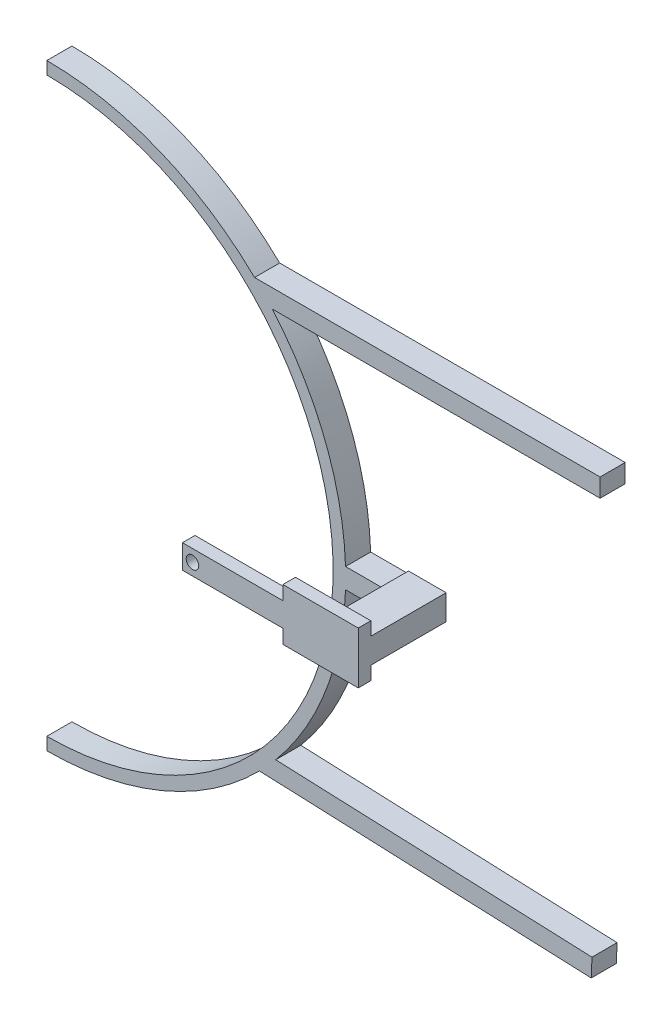
ISO-10303-21;
HEADER;
FILE_DESCRIPTION(('STEP AP214'),'2;1');
FILE_NAME('part.step','',(''),(''),'','','');
FILE_SCHEMA(('AUTOMOTIVE_DESIGN { 1 0 10303 214 1 1 1 1 }'));
ENDSEC;
DATA;
#1=APPLICATION_CONTEXT('core data for automotive mechanical design processes');
#2=APPLICATION_PROTOCOL_DEFINITION('international standard','automotive_design',2000,#1);
#3=PRODUCT_CONTEXT('',#1,'mechanical');
#4=PRODUCT('Part','Part','',(#3));
#5=PRODUCT_RELATED_PRODUCT_CATEGORY('part','',(#4));
#6=PRODUCT_DEFINITION_FORMATION('','',#4);
#7=PRODUCT_DEFINITION_CONTEXT('part definition',#1,'design');
#8=PRODUCT_DEFINITION('design','',#6,#7);
#9=PRODUCT_DEFINITION_SHAPE('','',#8);
#10=(LENGTH_UNIT() NAMED_UNIT(*) SI_UNIT(.MILLI.,.METRE.));
#11=(NAMED_UNIT(*) PLANE_ANGLE_UNIT() SI_UNIT($,.RADIAN.));
#12=(NAMED_UNIT(*) SI_UNIT($,.STERADIAN.) SOLID_ANGLE_UNIT());
#13=UNCERTAINTY_MEASURE_WITH_UNIT(LENGTH_MEASURE(1.E-05),#10,'distance_accuracy_value','');
#14=(GEOMETRIC_REPRESENTATION_CONTEXT(3) GLOBAL_UNCERTAINTY_ASSIGNED_CONTEXT((#13)) GLOBAL_UNIT_ASSIGNED_CONTEXT((#10,
#11,#12)) REPRESENTATION_CONTEXT('',''));
#15=CARTESIAN_POINT('',(0.,0.,0.));
#16=DIRECTION('',(0.,0.,1.));
#17=DIRECTION('',(1.,0.,0.));
#18=AXIS2_PLACEMENT_3D('',#15,#16,#17);
#19=CARTESIAN_POINT('',(-134.,0.,-20.));
#20=DIRECTION('',(0.,0.,-1.));
#21=DIRECTION('',(-1.,0.,0.));
#22=AXIS2_PLACEMENT_3D('',#19,#20,#21);
#23=CYLINDRICAL_SURFACE('',#22,119.);
#24=DIRECTION('',(0.,0.,-1.));
#25=VECTOR('',#24,1.);
#26=CARTESIAN_POINT('',(-42.8759842022691,-76.5337425250779,-20.));
#27=LINE('',#26,#25);
#28=CARTESIAN_POINT('',(-42.8759842022691,-76.5337425250779,-30.));
#29=VERTEX_POINT('',#28);
#30=CARTESIAN_POINT('',(-42.8759842022691,-76.5337425250779,-20.));
#31=VERTEX_POINT('',#30);
#32=EDGE_CURVE('E11',#29,#31,#27,.F.);
#33=ORIENTED_EDGE('',*,*,#32,.F.);
#34=CARTESIAN_POINT('',(-134.,0.,-30.));
#35=DIRECTION('',(0.,0.,-1.));
#36=DIRECTION('',(-1.,0.,0.));
#37=AXIS2_PLACEMENT_3D('',#34,#35,#36);
#38=CIRCLE('',#37,119.);
#39=CARTESIAN_POINT('',(-15.0672458907975,-4.,-30.));
#40=VERTEX_POINT('',#39);
#41=EDGE_CURVE('E298',#40,#29,#38,.T.);
#42=ORIENTED_EDGE('',*,*,#41,.F.);
#43=DIRECTION('',(0.,0.,-1.));
#44=VECTOR('',#43,1.);
#45=CARTESIAN_POINT('',(-15.0672458907975,-4.,-20.));
#46=LINE('',#45,#44);
#47=CARTESIAN_POINT('',(-15.0672458907975,-4.,-20.));
#48=VERTEX_POINT('',#47);
#49=EDGE_CURVE('E428',#48,#40,#46,.T.);
#50=ORIENTED_EDGE('',*,*,#49,.F.);
#51=CARTESIAN_POINT('',(-134.,0.,-20.));
#52=DIRECTION('',(0.,0.,-1.));
#53=DIRECTION('',(-1.,0.,0.));
#54=AXIS2_PLACEMENT_3D('',#51,#52,#53);
#55=CIRCLE('',#54,119.);
#56=EDGE_CURVE('E285',#48,#31,#55,.T.);
#57=ORIENTED_EDGE('',*,*,#56,.T.);
#58=EDGE_LOOP('',(#33,#42,#50,#57));
#59=FACE_BOUND('',#58,.T.);
#60=ADVANCED_FACE('F35',(#59),#23,.T.);
#61=DIRECTION('',(0.,0.,-1.));
#62=VECTOR('',#61,1.);
#63=CARTESIAN_POINT('',(-44.304263479232,78.2027803213991,-20.));
#64=LINE('',#63,#62);
#65=CARTESIAN_POINT('',(-44.304263479232,78.2027803213991,-20.));
#66=VERTEX_POINT('',#65);
#67=CARTESIAN_POINT('',(-44.3042634792321,78.2027803213991,-30.));
#68=VERTEX_POINT('',#67);
#69=EDGE_CURVE('E265',#66,#68,#64,.T.);
#70=ORIENTED_EDGE('',*,*,#69,.F.);
#71=CARTESIAN_POINT('',(-15.0672458907975,4.,-20.));
#72=VERTEX_POINT('',#71);
#73=EDGE_CURVE('E284',#66,#72,#55,.T.);
#74=ORIENTED_EDGE('',*,*,#73,.T.);
#75=DIRECTION('',(0.,0.,-1.));
#76=VECTOR('',#75,1.);
#77=CARTESIAN_POINT('',(-15.0672458907975,4.,-20.));
#78=LINE('',#77,#76);
#79=CARTESIAN_POINT('',(-15.0672458907975,4.,-30.));
#80=VERTEX_POINT('',#79);
#81=EDGE_CURVE('E304',#80,#72,#78,.F.);
#82=ORIENTED_EDGE('',*,*,#81,.F.);
#83=EDGE_CURVE('E297',#68,#80,#38,.T.);
#84=ORIENTED_EDGE('',*,*,#83,.F.);
#85=EDGE_LOOP('',(#70,#74,#82,#84));
#86=FACE_BOUND('',#85,.T.);
#87=ADVANCED_FACE('F446',(#86),#23,.T.);
#88=CARTESIAN_POINT('',(0.,5.,-30.));
#89=DIRECTION('',(1.,0.,0.));
#90=DIRECTION('',(0.,1.,0.));
#91=AXIS2_PLACEMENT_3D('',#88,#89,#90);
#92=PLANE('',#91);
#93=DIRECTION('',(0.,0.,-1.));
#94=VECTOR('',#93,1.);
#95=CARTESIAN_POINT('',(0.,4.,-30.));
#96=LINE('',#95,#94);
#97=CARTESIAN_POINT('',(0.,4.,-20.));
#98=VERTEX_POINT('',#97);
#99=CARTESIAN_POINT('',(0.,4.,-30.));
#100=VERTEX_POINT('',#99);
#101=EDGE_CURVE('E317',#98,#100,#96,.T.);
#102=ORIENTED_EDGE('',*,*,#101,.F.);
#103=DIRECTION('',(0.,1.,0.));
#104=VECTOR('',#103,1.);
#105=CARTESIAN_POINT('',(0.,4.,-20.));
#106=LINE('',#105,#104);
#107=CARTESIAN_POINT('',(0.,-4.,-20.));
#108=VERTEX_POINT('',#107);
#109=EDGE_CURVE('E314',#108,#98,#106,.T.);
#110=ORIENTED_EDGE('',*,*,#109,.F.);
#111=DIRECTION('',(0.,0.,1.));
#112=VECTOR('',#111,1.);
#113=CARTESIAN_POINT('',(0.,-4.,-30.));
#114=LINE('',#113,#112);
#115=CARTESIAN_POINT('',(0.,-4.,-30.));
#116=VERTEX_POINT('',#115);
#117=EDGE_CURVE('E320',#116,#108,#114,.T.);
#118=ORIENTED_EDGE('',*,*,#117,.F.);
#119=DIRECTION('',(0.,1.,0.));
#120=VECTOR('',#119,1.);
#121=CARTESIAN_POINT('',(0.,5.,-30.));
#122=LINE('',#121,#120);
#123=CARTESIAN_POINT('',(0.,-5.,-30.));
#124=VERTEX_POINT('',#123);
#125=EDGE_CURVE('E332',#124,#116,#122,.T.);
#126=ORIENTED_EDGE('',*,*,#125,.F.);
#127=DIRECTION('',(0.,0.,1.));
#128=VECTOR('',#127,1.);
#129=CARTESIAN_POINT('',(0.,-5.,-30.));
#130=LINE('',#129,#128);
#131=CARTESIAN_POINT('',(0.,-5.,0.));
#132=VERTEX_POINT('',#131);
#133=EDGE_CURVE('E342',#124,#132,#130,.T.);
#134=ORIENTED_EDGE('',*,*,#133,.T.);
#135=DIRECTION('',(0.,1.,0.));
#136=VECTOR('',#135,1.);
#137=CARTESIAN_POINT('',(0.,5.,0.));
#138=LINE('',#137,#136);
#139=CARTESIAN_POINT('',(0.,5.,0.));
#140=VERTEX_POINT('',#139);
#141=EDGE_CURVE('E331',#132,#140,#138,.T.);
#142=ORIENTED_EDGE('',*,*,#141,.T.);
#143=DIRECTION('',(0.,0.,1.));
#144=VECTOR('',#143,1.);
#145=CARTESIAN_POINT('',(0.,5.,-30.));
#146=LINE('',#145,#144);
#147=CARTESIAN_POINT('',(0.,5.,-30.));
#148=VERTEX_POINT('',#147);
#149=EDGE_CURVE('E359',#148,#140,#146,.T.);
#150=ORIENTED_EDGE('',*,*,#149,.F.);
#151=EDGE_CURVE('E336',#100,#148,#122,.T.);
#152=ORIENTED_EDGE('',*,*,#151,.F.);
#153=EDGE_LOOP('',(#102,#110,#118,#126,#134,#142,#150,#152));
#154=FACE_BOUND('',#153,.T.);
#155=ADVANCED_FACE('F490',(#154),#92,.F.);
#156=CARTESIAN_POINT('',(0.,0.,5.));
#157=DIRECTION('',(0.,0.,-1.));
#158=DIRECTION('',(-1.,0.,0.));
#159=AXIS2_PLACEMENT_3D('',#156,#157,#158);
#160=PLANE('',#159);
#161=DIRECTION('',(-1.,0.,0.));
#162=VECTOR('',#161,1.);
#163=CARTESIAN_POINT('',(15.,10.3276353276353,5.));
#164=LINE('',#163,#162);
#165=CARTESIAN_POINT('',(15.,10.3276353276353,5.));
#166=VERTEX_POINT('',#165);
#167=CARTESIAN_POINT('',(-15.,10.3276353276353,5.));
#168=VERTEX_POINT('',#167);
#169=EDGE_CURVE('E369',#166,#168,#164,.T.);
#170=ORIENTED_EDGE('',*,*,#169,.T.);
#171=DIRECTION('',(0.,-1.,0.));
#172=VECTOR('',#171,1.);
#173=CARTESIAN_POINT('',(-15.,4.74891782983586,5.));
#174=LINE('',#173,#172);
#175=CARTESIAN_POINT('',(-15.,4.74891782983586,5.));
#176=VERTEX_POINT('',#175);
#177=EDGE_CURVE('E372',#168,#176,#174,.T.);
#178=ORIENTED_EDGE('',*,*,#177,.T.);
#179=DIRECTION('',(-1.,0.,0.));
#180=VECTOR('',#179,1.);
#181=CARTESIAN_POINT('',(-15.,4.74891782983586,5.));
#182=LINE('',#181,#180);
#183=CARTESIAN_POINT('',(-55.,4.74891782983585,5.));
#184=VERTEX_POINT('',#183);
#185=EDGE_CURVE('E375',#176,#184,#182,.T.);
#186=ORIENTED_EDGE('',*,*,#185,.T.);
#187=DIRECTION('',(0.,-1.,0.));
#188=VECTOR('',#187,1.);
#189=CARTESIAN_POINT('',(-55.,-4.74891782983586,5.));
#190=LINE('',#189,#188);
#191=CARTESIAN_POINT('',(-55.,-4.74891782983586,5.));
#192=VERTEX_POINT('',#191);
#193=EDGE_CURVE('E377',#184,#192,#190,.T.);
#194=ORIENTED_EDGE('',*,*,#193,.T.);
#195=DIRECTION('',(1.,0.,0.));
#196=VECTOR('',#195,1.);
#197=CARTESIAN_POINT('',(-15.,-4.74891782983586,5.));
#198=LINE('',#197,#196);
#199=CARTESIAN_POINT('',(-15.,-4.74891782983586,5.));
#200=VERTEX_POINT('',#199);
#201=EDGE_CURVE('E379',#192,#200,#198,.T.);
#202=ORIENTED_EDGE('',*,*,#201,.T.);
#203=DIRECTION('',(0.,-1.,0.));
#204=VECTOR('',#203,1.);
#205=CARTESIAN_POINT('',(-15.,-4.74891782983586,5.));
#206=LINE('',#205,#204);
#207=CARTESIAN_POINT('',(-15.,-10.3276353276353,5.));
#208=VERTEX_POINT('',#207);
#209=EDGE_CURVE('E381',#200,#208,#206,.T.);
#210=ORIENTED_EDGE('',*,*,#209,.T.);
#211=DIRECTION('',(1.,0.,0.));
#212=VECTOR('',#211,1.);
#213=CARTESIAN_POINT('',(15.,-10.3276353276353,5.));
#214=LINE('',#213,#212);
#215=CARTESIAN_POINT('',(15.,-10.3276353276353,5.));
#216=VERTEX_POINT('',#215);
#217=EDGE_CURVE('E383',#208,#216,#214,.T.);
#218=ORIENTED_EDGE('',*,*,#217,.T.);
#219=DIRECTION('',(0.,1.,0.));
#220=VECTOR('',#219,1.);
#221=CARTESIAN_POINT('',(15.,-10.3276353276353,5.));
#222=LINE('',#221,#220);
#223=EDGE_CURVE('E385',#216,#166,#222,.T.);
#224=ORIENTED_EDGE('',*,*,#223,.T.);
#225=EDGE_LOOP('',(#170,#178,#186,#194,#202,#210,#218,#224));
#226=FACE_BOUND('',#225,.T.);
#227=CARTESIAN_POINT('',(-51.,0.,5.));
#228=DIRECTION('',(0.,0.,1.));
#229=DIRECTION('',(1.,0.,0.));
#230=AXIS2_PLACEMENT_3D('',#227,#228,#229);
#231=CIRCLE('',#230,2.5);
#232=CARTESIAN_POINT('',(-48.5,0.,5.));
#233=VERTEX_POINT('',#232);
#234=EDGE_CURVE('E363',#233,#233,#231,.T.);
#235=ORIENTED_EDGE('',*,*,#234,.F.);
#236=EDGE_LOOP('',(#235));
#237=FACE_BOUND('',#236,.T.);
#238=ADVANCED_FACE('F522',(#226,#237),#160,.F.);
#239=CARTESIAN_POINT('',(0.,0.,0.));
#240=DIRECTION('',(0.,0.,-1.));
#241=DIRECTION('',(-1.,0.,0.));
#242=AXIS2_PLACEMENT_3D('',#239,#240,#241);
#243=PLANE('',#242);
#244=DIRECTION('',(-1.,0.,0.));
#245=VECTOR('',#244,1.);
#246=CARTESIAN_POINT('',(15.,-5.,0.));
#247=LINE('',#246,#245);
#248=CARTESIAN_POINT('',(15.,-5.,0.));
#249=VERTEX_POINT('',#248);
#250=EDGE_CURVE('E348',#249,#132,#247,.T.);
#251=ORIENTED_EDGE('',*,*,#250,.F.);
#252=DIRECTION('',(0.,1.,0.));
#253=VECTOR('',#252,1.);
#254=CARTESIAN_POINT('',(15.,-10.3276353276353,0.));
#255=LINE('',#254,#253);
#256=CARTESIAN_POINT('',(15.,-10.3276353276353,0.));
#257=VERTEX_POINT('',#256);
#258=EDGE_CURVE('E373',#257,#249,#255,.T.);
#259=ORIENTED_EDGE('',*,*,#258,.F.);
#260=DIRECTION('',(1.,0.,0.));
#261=VECTOR('',#260,1.);
#262=CARTESIAN_POINT('',(15.,-10.3276353276353,0.));
#263=LINE('',#262,#261);
#264=CARTESIAN_POINT('',(-15.,-10.3276353276353,0.));
#265=VERTEX_POINT('',#264);
#266=EDGE_CURVE('E400',#265,#257,#263,.T.);
#267=ORIENTED_EDGE('',*,*,#266,.F.);
#268=DIRECTION('',(0.,-1.,0.));
#269=VECTOR('',#268,1.);
#270=CARTESIAN_POINT('',(-15.,-4.74891782983586,0.));
#271=LINE('',#270,#269);
#272=CARTESIAN_POINT('',(-15.,-4.74891782983586,0.));
#273=VERTEX_POINT('',#272);
#274=EDGE_CURVE('E398',#273,#265,#271,.T.);
#275=ORIENTED_EDGE('',*,*,#274,.F.);
#276=DIRECTION('',(1.,0.,0.));
#277=VECTOR('',#276,1.);
#278=CARTESIAN_POINT('',(-15.,-4.74891782983586,0.));
#279=LINE('',#278,#277);
#280=CARTESIAN_POINT('',(-55.,-4.74891782983586,0.));
#281=VERTEX_POINT('',#280);
#282=EDGE_CURVE('E396',#281,#273,#279,.T.);
#283=ORIENTED_EDGE('',*,*,#282,.F.);
#284=DIRECTION('',(0.,-1.,0.));
#285=VECTOR('',#284,1.);
#286=CARTESIAN_POINT('',(-55.,-4.74891782983586,0.));
#287=LINE('',#286,#285);
#288=CARTESIAN_POINT('',(-55.,4.74891782983585,0.));
#289=VERTEX_POINT('',#288);
#290=EDGE_CURVE('E394',#289,#281,#287,.T.);
#291=ORIENTED_EDGE('',*,*,#290,.F.);
#292=DIRECTION('',(-1.,0.,0.));
#293=VECTOR('',#292,1.);
#294=CARTESIAN_POINT('',(-15.,4.74891782983586,0.));
#295=LINE('',#294,#293);
#296=CARTESIAN_POINT('',(-15.,4.74891782983586,0.));
#297=VERTEX_POINT('',#296);
#298=EDGE_CURVE('E392',#297,#289,#295,.T.);
#299=ORIENTED_EDGE('',*,*,#298,.F.);
#300=DIRECTION('',(0.,-1.,0.));
#301=VECTOR('',#300,1.);
#302=CARTESIAN_POINT('',(-15.,4.74891782983586,0.));
#303=LINE('',#302,#301);
#304=CARTESIAN_POINT('',(-15.,10.3276353276353,0.));
#305=VERTEX_POINT('',#304);
#306=EDGE_CURVE('E390',#305,#297,#303,.T.);
#307=ORIENTED_EDGE('',*,*,#306,.F.);
#308=DIRECTION('',(-1.,0.,0.));
#309=VECTOR('',#308,1.);
#310=CARTESIAN_POINT('',(15.,10.3276353276353,0.));
#311=LINE('',#310,#309);
#312=CARTESIAN_POINT('',(15.,10.3276353276353,0.));
#313=VERTEX_POINT('',#312);
#314=EDGE_CURVE('E366',#313,#305,#311,.T.);
#315=ORIENTED_EDGE('',*,*,#314,.F.);
#316=CARTESIAN_POINT('',(15.,5.,0.));
#317=VERTEX_POINT('',#316);
#318=EDGE_CURVE('E402',#317,#313,#255,.T.);
#319=ORIENTED_EDGE('',*,*,#318,.F.);
#320=DIRECTION('',(1.,0.,0.));
#321=VECTOR('',#320,1.);
#322=CARTESIAN_POINT('',(15.,5.,0.));
#323=LINE('',#322,#321);
#324=EDGE_CURVE('E345',#140,#317,#323,.T.);
#325=ORIENTED_EDGE('',*,*,#324,.F.);
#326=ORIENTED_EDGE('',*,*,#141,.F.);
#327=EDGE_LOOP('',(#251,#259,#267,#275,#283,#291,#299,#307,#315,#319,#325,#326));
#328=FACE_BOUND('',#327,.T.);
#329=CARTESIAN_POINT('',(-51.,0.,0.));
#330=DIRECTION('',(0.,0.,1.));
#331=DIRECTION('',(1.,0.,0.));
#332=AXIS2_PLACEMENT_3D('',#329,#330,#331);
#333=CIRCLE('',#332,2.5);
#334=CARTESIAN_POINT('',(-48.5,0.,0.));
#335=VERTEX_POINT('',#334);
#336=EDGE_CURVE('E362',#335,#335,#333,.T.);
#337=ORIENTED_EDGE('',*,*,#336,.T.);
#338=EDGE_LOOP('',(#337));
#339=FACE_BOUND('',#338,.T.);
#340=ADVANCED_FACE('F530',(#328,#339),#243,.T.);
#341=CARTESIAN_POINT('',(15.,10.3276353276353,5.));
#342=DIRECTION('',(0.,-1.,0.));
#343=DIRECTION('',(1.,0.,0.));
#344=AXIS2_PLACEMENT_3D('',#341,#342,#343);
#345=PLANE('',#344);
#346=ORIENTED_EDGE('',*,*,#314,.T.);
#347=DIRECTION('',(0.,0.,-1.));
#348=VECTOR('',#347,1.);
#349=CARTESIAN_POINT('',(-15.,10.3276353276353,5.));
#350=LINE('',#349,#348);
#351=EDGE_CURVE('E425',#168,#305,#350,.T.);
#352=ORIENTED_EDGE('',*,*,#351,.F.);
#353=ORIENTED_EDGE('',*,*,#169,.F.);
#354=DIRECTION('',(0.,0.,-1.));
#355=VECTOR('',#354,1.);
#356=CARTESIAN_POINT('',(15.,10.3276353276353,5.));
#357=LINE('',#356,#355);
#358=EDGE_CURVE('E387',#166,#313,#357,.T.);
#359=ORIENTED_EDGE('',*,*,#358,.T.);
#360=EDGE_LOOP('',(#346,#352,#353,#359));
#361=FACE_BOUND('',#360,.T.);
#362=ADVANCED_FACE('F37',(#361),#345,.F.);
#363=CARTESIAN_POINT('',(-15.,4.74891782983586,5.));
#364=DIRECTION('',(1.,0.,0.));
#365=DIRECTION('',(0.,0.,-1.));
#366=AXIS2_PLACEMENT_3D('',#363,#364,#365);
#367=PLANE('',#366);
#368=ORIENTED_EDGE('',*,*,#306,.T.);
#369=DIRECTION('',(0.,0.,-1.));
#370=VECTOR('',#369,1.);
#371=CARTESIAN_POINT('',(-15.,4.74891782983586,5.));
#372=LINE('',#371,#370);
#373=EDGE_CURVE('E422',#176,#297,#372,.T.);
#374=ORIENTED_EDGE('',*,*,#373,.F.);
#375=ORIENTED_EDGE('',*,*,#177,.F.);
#376=ORIENTED_EDGE('',*,*,#351,.T.);
#377=EDGE_LOOP('',(#368,#374,#375,#376));
#378=FACE_BOUND('',#377,.T.);
#379=ADVANCED_FACE('F556',(#378),#367,.F.);
#380=CARTESIAN_POINT('',(-15.,4.74891782983586,5.));
#381=DIRECTION('',(0.,-1.,0.));
#382=DIRECTION('',(1.,0.,0.));
#383=AXIS2_PLACEMENT_3D('',#380,#381,#382);
#384=PLANE('',#383);
#385=ORIENTED_EDGE('',*,*,#298,.T.);
#386=DIRECTION('',(0.,0.,-1.));
#387=VECTOR('',#386,1.);
#388=CARTESIAN_POINT('',(-55.,4.74891782983585,5.));
#389=LINE('',#388,#387);
#390=EDGE_CURVE('E419',#184,#289,#389,.T.);
#391=ORIENTED_EDGE('',*,*,#390,.F.);
#392=ORIENTED_EDGE('',*,*,#185,.F.);
#393=ORIENTED_EDGE('',*,*,#373,.T.);
#394=EDGE_LOOP('',(#385,#391,#392,#393));
#395=FACE_BOUND('',#394,.T.);
#396=ADVANCED_FACE('F553',(#395),#384,.F.);
#397=CARTESIAN_POINT('',(-55.,-4.74891782983586,5.));
#398=DIRECTION('',(1.,0.,0.));
#399=DIRECTION('',(0.,0.,-1.));
#400=AXIS2_PLACEMENT_3D('',#397,#398,#399);
#401=PLANE('',#400);
#402=ORIENTED_EDGE('',*,*,#290,.T.);
#403=DIRECTION('',(0.,0.,-1.));
#404=VECTOR('',#403,1.);
#405=CARTESIAN_POINT('',(-55.,-4.74891782983586,5.));
#406=LINE('',#405,#404);
#407=EDGE_CURVE('E416',#192,#281,#406,.T.);
#408=ORIENTED_EDGE('',*,*,#407,.F.);
#409=ORIENTED_EDGE('',*,*,#193,.F.);
#410=ORIENTED_EDGE('',*,*,#390,.T.);
#411=EDGE_LOOP('',(#402,#408,#409,#410));
#412=FACE_BOUND('',#411,.T.);
#413=ADVANCED_FACE('F549',(#412),#401,.F.);
#414=CARTESIAN_POINT('',(-15.,-4.74891782983586,5.));
#415=DIRECTION('',(0.,1.,0.));
#416=DIRECTION('',(-1.,0.,0.));
#417=AXIS2_PLACEMENT_3D('',#414,#415,#416);
#418=PLANE('',#417);
#419=ORIENTED_EDGE('',*,*,#282,.T.);
#420=DIRECTION('',(0.,0.,-1.));
#421=VECTOR('',#420,1.);
#422=CARTESIAN_POINT('',(-15.,-4.74891782983586,5.));
#423=LINE('',#422,#421);
#424=EDGE_CURVE('E413',#200,#273,#423,.T.);
#425=ORIENTED_EDGE('',*,*,#424,.F.);
#426=ORIENTED_EDGE('',*,*,#201,.F.);
#427=ORIENTED_EDGE('',*,*,#407,.T.);
#428=EDGE_LOOP('',(#419,#425,#426,#427));
#429=FACE_BOUND('',#428,.T.);
#430=ADVANCED_FACE('F545',(#429),#418,.F.);
#431=CARTESIAN_POINT('',(-15.,-4.74891782983586,5.));
#432=DIRECTION('',(1.,0.,0.));
#433=DIRECTION('',(0.,1.,0.));
#434=AXIS2_PLACEMENT_3D('',#431,#432,#433);
#435=PLANE('',#434);
#436=ORIENTED_EDGE('',*,*,#274,.T.);
#437=DIRECTION('',(0.,0.,-1.));
#438=VECTOR('',#437,1.);
#439=CARTESIAN_POINT('',(-15.,-10.3276353276353,5.));
#440=LINE('',#439,#438);
#441=EDGE_CURVE('E410',#208,#265,#440,.T.);
#442=ORIENTED_EDGE('',*,*,#441,.F.);
#443=ORIENTED_EDGE('',*,*,#209,.F.);
#444=ORIENTED_EDGE('',*,*,#424,.T.);
#445=EDGE_LOOP('',(#436,#442,#443,#444));
#446=FACE_BOUND('',#445,.T.);
#447=ADVANCED_FACE('F541',(#446),#435,.F.);
#448=CARTESIAN_POINT('',(15.,-10.3276353276353,5.));
#449=DIRECTION('',(0.,1.,0.));
#450=DIRECTION('',(-1.,0.,0.));
#451=AXIS2_PLACEMENT_3D('',#448,#449,#450);
#452=PLANE('',#451);
#453=ORIENTED_EDGE('',*,*,#266,.T.);
#454=DIRECTION('',(0.,0.,-1.));
#455=VECTOR('',#454,1.);
#456=CARTESIAN_POINT('',(15.,-10.3276353276353,5.));
#457=LINE('',#456,#455);
#458=EDGE_CURVE('E407',#216,#257,#457,.T.);
#459=ORIENTED_EDGE('',*,*,#458,.F.);
#460=ORIENTED_EDGE('',*,*,#217,.F.);
#461=ORIENTED_EDGE('',*,*,#441,.T.);
#462=EDGE_LOOP('',(#453,#459,#460,#461));
#463=FACE_BOUND('',#462,.T.);
#464=ADVANCED_FACE('F537',(#463),#452,.F.);
#465=CARTESIAN_POINT('',(15.,-10.3276353276353,5.));
#466=DIRECTION('',(-1.,0.,0.));
#467=DIRECTION('',(0.,0.,1.));
#468=AXIS2_PLACEMENT_3D('',#465,#466,#467);
#469=PLANE('',#468);
#470=ORIENTED_EDGE('',*,*,#258,.T.);
#471=DIRECTION('',(0.,0.,1.));
#472=VECTOR('',#471,1.);
#473=CARTESIAN_POINT('',(15.,-5.,-30.));
#474=LINE('',#473,#472);
#475=CARTESIAN_POINT('',(15.,-5.,-30.));
#476=VERTEX_POINT('',#475);
#477=EDGE_CURVE('E353',#476,#249,#474,.T.);
#478=ORIENTED_EDGE('',*,*,#477,.F.);
#479=DIRECTION('',(0.,-1.,0.));
#480=VECTOR('',#479,1.);
#481=CARTESIAN_POINT('',(15.,5.,-30.));
#482=LINE('',#481,#480);
#483=CARTESIAN_POINT('',(15.,5.,-30.));
#484=VERTEX_POINT('',#483);
#485=EDGE_CURVE('E338',#484,#476,#482,.T.);
#486=ORIENTED_EDGE('',*,*,#485,.F.);
#487=DIRECTION('',(0.,0.,1.));
#488=VECTOR('',#487,1.);
#489=CARTESIAN_POINT('',(15.,5.,-30.));
#490=LINE('',#489,#488);
#491=EDGE_CURVE('E356',#484,#317,#490,.T.);
#492=ORIENTED_EDGE('',*,*,#491,.T.);
#493=ORIENTED_EDGE('',*,*,#318,.T.);
#494=ORIENTED_EDGE('',*,*,#358,.F.);
#495=ORIENTED_EDGE('',*,*,#223,.F.);
#496=ORIENTED_EDGE('',*,*,#458,.T.);
#497=EDGE_LOOP('',(#470,#478,#486,#492,#493,#494,#495,#496));
#498=FACE_BOUND('',#497,.T.);
#499=ADVANCED_FACE('F526',(#498),#469,.F.);
#500=CARTESIAN_POINT('',(-51.,0.,5.));
#501=DIRECTION('',(0.,0.,-1.));
#502=DIRECTION('',(-1.,0.,0.));
#503=AXIS2_PLACEMENT_3D('',#500,#501,#502);
#504=CYLINDRICAL_SURFACE('',#503,2.5);
#505=ORIENTED_EDGE('',*,*,#234,.T.);
#506=EDGE_LOOP('',(#505));
#507=FACE_BOUND('',#506,.T.);
#508=ORIENTED_EDGE('',*,*,#336,.F.);
#509=EDGE_LOOP('',(#508));
#510=FACE_BOUND('',#509,.T.);
#511=ADVANCED_FACE('F518',(#507,#510),#504,.F.);
#512=CARTESIAN_POINT('',(15.,5.,-30.));
#513=DIRECTION('',(0.,-1.,0.));
#514=DIRECTION('',(0.,0.,-1.));
#515=AXIS2_PLACEMENT_3D('',#512,#513,#514);
#516=PLANE('',#515);
#517=ORIENTED_EDGE('',*,*,#324,.T.);
#518=ORIENTED_EDGE('',*,*,#491,.F.);
#519=DIRECTION('',(1.,0.,0.));
#520=VECTOR('',#519,1.);
#521=CARTESIAN_POINT('',(15.,5.,-30.));
#522=LINE('',#521,#520);
#523=EDGE_CURVE('E335',#148,#484,#522,.T.);
#524=ORIENTED_EDGE('',*,*,#523,.F.);
#525=ORIENTED_EDGE('',*,*,#149,.T.);
#526=EDGE_LOOP('',(#517,#518,#524,#525));
#527=FACE_BOUND('',#526,.T.);
#528=ADVANCED_FACE('F514',(#527),#516,.F.);
#529=CARTESIAN_POINT('',(15.,-5.,-30.));
#530=DIRECTION('',(0.,1.,0.));
#531=DIRECTION('',(0.,0.,1.));
#532=AXIS2_PLACEMENT_3D('',#529,#530,#531);
#533=PLANE('',#532);
#534=ORIENTED_EDGE('',*,*,#250,.T.);
#535=ORIENTED_EDGE('',*,*,#133,.F.);
#536=DIRECTION('',(-1.,0.,0.));
#537=VECTOR('',#536,1.);
#538=CARTESIAN_POINT('',(15.,-5.,-30.));
#539=LINE('',#538,#537);
#540=EDGE_CURVE('E340',#476,#124,#539,.T.);
#541=ORIENTED_EDGE('',*,*,#540,.F.);
#542=ORIENTED_EDGE('',*,*,#477,.T.);
#543=EDGE_LOOP('',(#534,#535,#541,#542));
#544=FACE_BOUND('',#543,.T.);
#545=ADVANCED_FACE('F511',(#544),#533,.F.);
#546=CARTESIAN_POINT('',(0.,0.,-30.));
#547=DIRECTION('',(0.,0.,-1.));
#548=DIRECTION('',(-1.,0.,0.));
#549=AXIS2_PLACEMENT_3D('',#546,#547,#548);
#550=PLANE('',#549);
#551=ORIENTED_EDGE('',*,*,#41,.T.);
#552=DIRECTION('',(0.999184266338035,-0.0403831883650024,0.));
#553=VECTOR('',#552,1.);
#554=CARTESIAN_POINT('',(83.0445886590952,-81.6229681906561,-30.));
#555=LINE('',#554,#553);
#556=CARTESIAN_POINT('',(83.0445886590952,-81.6229681906561,-30.));
#557=VERTEX_POINT('',#556);
#558=EDGE_CURVE('E241',#29,#557,#555,.T.);
#559=ORIENTED_EDGE('',*,*,#558,.T.);
#560=DIRECTION('',(-0.0403831883650027,-0.999184266338035,0.));
#561=VECTOR('',#560,1.);
#562=CARTESIAN_POINT('',(82.7479558999371,-88.9624279468375,-30.));
#563=LINE('',#562,#561);
#564=CARTESIAN_POINT('',(82.7479558999371,-88.9624279468375,-30.));
#565=VERTEX_POINT('',#564);
#566=EDGE_CURVE('E246',#557,#565,#563,.T.);
#567=ORIENTED_EDGE('',*,*,#566,.T.);
#568=DIRECTION('',(-0.999184266338035,0.0403831883650024,0.));
#569=VECTOR('',#568,1.);
#570=CARTESIAN_POINT('',(-54.6934738398777,-83.407573518755,-30.));
#571=LINE('',#570,#569);
#572=CARTESIAN_POINT('',(-49.33590536104,-83.6241058485246,-30.));
#573=VERTEX_POINT('',#572);
#574=EDGE_CURVE('E50',#565,#573,#571,.T.);
#575=ORIENTED_EDGE('',*,*,#574,.T.);
#576=CARTESIAN_POINT('',(-134.,-119.,-30.));
#577=VERTEX_POINT('',#576);
#578=EDGE_CURVE('E293',#573,#577,#38,.T.);
#579=ORIENTED_EDGE('',*,*,#578,.T.);
#580=DIRECTION('',(0.,1.,0.));
#581=VECTOR('',#580,1.);
#582=CARTESIAN_POINT('',(-134.,-114.,-30.));
#583=LINE('',#582,#581);
#584=CARTESIAN_POINT('',(-134.,-114.,-30.));
#585=VERTEX_POINT('',#584);
#586=EDGE_CURVE('E277',#577,#585,#583,.T.);
#587=ORIENTED_EDGE('',*,*,#586,.T.);
#588=CARTESIAN_POINT('',(-134.,0.,-30.));
#589=DIRECTION('',(0.,0.,1.));
#590=DIRECTION('',(-1.,0.,0.));
#591=AXIS2_PLACEMENT_3D('',#588,#589,#590);
#592=CIRCLE('',#591,114.);
#593=CARTESIAN_POINT('',(-134.,114.,-30.));
#594=VERTEX_POINT('',#593);
#595=EDGE_CURVE('E267',#585,#594,#592,.T.);
#596=ORIENTED_EDGE('',*,*,#595,.T.);
#597=DIRECTION('',(0.,1.,0.));
#598=VECTOR('',#597,1.);
#599=CARTESIAN_POINT('',(-134.,114.,-30.));
#600=LINE('',#599,#598);
#601=CARTESIAN_POINT('',(-134.,119.,-30.));
#602=VERTEX_POINT('',#601);
#603=EDGE_CURVE('E290',#594,#602,#600,.T.);
#604=ORIENTED_EDGE('',*,*,#603,.T.);
#605=CARTESIAN_POINT('',(-51.280594779701,85.548232009785,-30.));
#606=VERTEX_POINT('',#605);
#607=EDGE_CURVE('E294',#602,#606,#38,.T.);
#608=ORIENTED_EDGE('',*,*,#607,.T.);
#609=DIRECTION('',(1.,0.,0.));
#610=VECTOR('',#609,1.);
#611=CARTESIAN_POINT('',(-51.280594779701,85.548232009785,-30.));
#612=LINE('',#611,#610);
#613=CARTESIAN_POINT('',(86.2730420920358,85.548232009785,-30.));
#614=VERTEX_POINT('',#613);
#615=EDGE_CURVE('E249',#606,#614,#612,.T.);
#616=ORIENTED_EDGE('',*,*,#615,.T.);
#617=DIRECTION('',(0.,-1.,0.));
#618=VECTOR('',#617,1.);
#619=CARTESIAN_POINT('',(86.2730420920358,85.548232009785,-30.));
#620=LINE('',#619,#618);
#621=CARTESIAN_POINT('',(86.2730420920358,78.2027803213991,-30.));
#622=VERTEX_POINT('',#621);
#623=EDGE_CURVE('E262',#614,#622,#620,.T.);
#624=ORIENTED_EDGE('',*,*,#623,.T.);
#625=DIRECTION('',(-1.,0.,0.));
#626=VECTOR('',#625,1.);
#627=CARTESIAN_POINT('',(86.2730420920358,78.2027803213991,-30.));
#628=LINE('',#627,#626);
#629=EDGE_CURVE('E57',#622,#68,#628,.T.);
#630=ORIENTED_EDGE('',*,*,#629,.T.);
#631=ORIENTED_EDGE('',*,*,#83,.T.);
#632=DIRECTION('',(1.,0.,0.));
#633=VECTOR('',#632,1.);
#634=CARTESIAN_POINT('',(-20.,4.,-30.));
#635=LINE('',#634,#633);
#636=EDGE_CURVE('E327',#80,#100,#635,.T.);
#637=ORIENTED_EDGE('',*,*,#636,.T.);
#638=ORIENTED_EDGE('',*,*,#151,.T.);
#639=ORIENTED_EDGE('',*,*,#523,.T.);
#640=ORIENTED_EDGE('',*,*,#485,.T.);
#641=ORIENTED_EDGE('',*,*,#540,.T.);
#642=ORIENTED_EDGE('',*,*,#125,.T.);
#643=DIRECTION('',(1.,0.,0.));
#644=VECTOR('',#643,1.);
#645=CARTESIAN_POINT('',(-20.,-4.,-30.));
#646=LINE('',#645,#644);
#647=EDGE_CURVE('E325',#40,#116,#646,.T.);
#648=ORIENTED_EDGE('',*,*,#647,.F.);
#649=EDGE_LOOP('',(#551,#559,#567,#575,#579,#587,#596,#604,#608,#616,#624,#630,#631,#637,#638,
#639,#640,#641,#642,#648));
#650=FACE_BOUND('',#649,.T.);
#651=ADVANCED_FACE('F437',(#650),#550,.T.);
#652=CARTESIAN_POINT('',(-20.,4.,-20.));
#653=DIRECTION('',(0.,0.,-1.));
#654=DIRECTION('',(-1.,0.,0.));
#655=AXIS2_PLACEMENT_3D('',#652,#653,#654);
#656=PLANE('',#655);
#657=DIRECTION('',(0.999184266338035,-0.0403831883650024,0.));
#658=VECTOR('',#657,1.);
#659=CARTESIAN_POINT('',(83.0445886590952,-81.6229681906561,-20.));
#660=LINE('',#659,#658);
#661=CARTESIAN_POINT('',(83.0445886590952,-81.6229681906561,-20.));
#662=VERTEX_POINT('',#661);
#663=EDGE_CURVE('E227',#31,#662,#660,.T.);
#664=ORIENTED_EDGE('',*,*,#663,.F.);
#665=ORIENTED_EDGE('',*,*,#56,.F.);
#666=DIRECTION('',(1.,0.,0.));
#667=VECTOR('',#666,1.);
#668=CARTESIAN_POINT('',(-20.,-4.,-20.));
#669=LINE('',#668,#667);
#670=EDGE_CURVE('E323',#48,#108,#669,.T.);
#671=ORIENTED_EDGE('',*,*,#670,.T.);
#672=ORIENTED_EDGE('',*,*,#109,.T.);
#673=DIRECTION('',(1.,0.,0.));
#674=VECTOR('',#673,1.);
#675=CARTESIAN_POINT('',(-20.,4.,-20.));
#676=LINE('',#675,#674);
#677=EDGE_CURVE('E329',#72,#98,#676,.T.);
#678=ORIENTED_EDGE('',*,*,#677,.F.);
#679=ORIENTED_EDGE('',*,*,#73,.F.);
#680=DIRECTION('',(-1.,0.,0.));
#681=VECTOR('',#680,1.);
#682=CARTESIAN_POINT('',(86.2730420920358,78.2027803213991,-20.));
#683=LINE('',#682,#681);
#684=CARTESIAN_POINT('',(86.2730420920358,78.2027803213991,-20.));
#685=VERTEX_POINT('',#684);
#686=EDGE_CURVE('E257',#685,#66,#683,.T.);
#687=ORIENTED_EDGE('',*,*,#686,.F.);
#688=DIRECTION('',(0.,-1.,0.));
#689=VECTOR('',#688,1.);
#690=CARTESIAN_POINT('',(86.2730420920358,85.548232009785,-20.));
#691=LINE('',#690,#689);
#692=CARTESIAN_POINT('',(86.2730420920358,85.548232009785,-20.));
#693=VERTEX_POINT('',#692);
#694=EDGE_CURVE('E254',#693,#685,#691,.T.);
#695=ORIENTED_EDGE('',*,*,#694,.F.);
#696=DIRECTION('',(1.,0.,0.));
#697=VECTOR('',#696,1.);
#698=CARTESIAN_POINT('',(-51.280594779701,85.548232009785,-20.));
#699=LINE('',#698,#697);
#700=CARTESIAN_POINT('',(-51.280594779701,85.548232009785,-20.));
#701=VERTEX_POINT('',#700);
#702=EDGE_CURVE('E251',#701,#693,#699,.T.);
#703=ORIENTED_EDGE('',*,*,#702,.F.);
#704=CARTESIAN_POINT('',(-134.,119.,-20.));
#705=VERTEX_POINT('',#704);
#706=EDGE_CURVE('E280',#705,#701,#55,.T.);
#707=ORIENTED_EDGE('',*,*,#706,.F.);
#708=DIRECTION('',(0.,1.,0.));
#709=VECTOR('',#708,1.);
#710=CARTESIAN_POINT('',(-134.,114.,-20.));
#711=LINE('',#710,#709);
#712=CARTESIAN_POINT('',(-134.,114.,-20.));
#713=VERTEX_POINT('',#712);
#714=EDGE_CURVE('E276',#713,#705,#711,.T.);
#715=ORIENTED_EDGE('',*,*,#714,.F.);
#716=CARTESIAN_POINT('',(-134.,0.,-20.));
#717=DIRECTION('',(0.,0.,1.));
#718=DIRECTION('',(-1.,0.,0.));
#719=AXIS2_PLACEMENT_3D('',#716,#717,#718);
#720=CIRCLE('',#719,114.);
#721=CARTESIAN_POINT('',(-134.,-114.,-20.));
#722=VERTEX_POINT('',#721);
#723=EDGE_CURVE('E274',#722,#713,#720,.T.);
#724=ORIENTED_EDGE('',*,*,#723,.F.);
#725=DIRECTION('',(0.,1.,0.));
#726=VECTOR('',#725,1.);
#727=CARTESIAN_POINT('',(-134.,-114.,-20.));
#728=LINE('',#727,#726);
#729=CARTESIAN_POINT('',(-134.,-119.,-20.));
#730=VERTEX_POINT('',#729);
#731=EDGE_CURVE('E283',#730,#722,#728,.T.);
#732=ORIENTED_EDGE('',*,*,#731,.F.);
#733=CARTESIAN_POINT('',(-49.33590536104,-83.6241058485246,-20.));
#734=VERTEX_POINT('',#733);
#735=EDGE_CURVE('E236',#734,#730,#55,.T.);
#736=ORIENTED_EDGE('',*,*,#735,.F.);
#737=DIRECTION('',(-0.999184266338035,0.0403831883650024,0.));
#738=VECTOR('',#737,1.);
#739=CARTESIAN_POINT('',(-54.6934738398777,-83.407573518755,-20.));
#740=LINE('',#739,#738);
#741=CARTESIAN_POINT('',(82.7479558999371,-88.9624279468375,-20.));
#742=VERTEX_POINT('',#741);
#743=EDGE_CURVE('E221',#742,#734,#740,.T.);
#744=ORIENTED_EDGE('',*,*,#743,.F.);
#745=DIRECTION('',(-0.0403831883650027,-0.999184266338035,0.));
#746=VECTOR('',#745,1.);
#747=CARTESIAN_POINT('',(82.7479558999371,-88.9624279468375,-20.));
#748=LINE('',#747,#746);
#749=EDGE_CURVE('E234',#662,#742,#748,.T.);
#750=ORIENTED_EDGE('',*,*,#749,.F.);
#751=EDGE_LOOP('',(#664,#665,#671,#672,#678,#679,#687,#695,#703,#707,#715,#724,#732,#736,#744,#750));
#752=FACE_BOUND('',#751,.T.);
#753=ADVANCED_FACE('F233',(#752),#656,.F.);
#754=CARTESIAN_POINT('',(-20.,4.,-30.));
#755=DIRECTION('',(0.,-1.,0.));
#756=DIRECTION('',(1.,0.,0.));
#757=AXIS2_PLACEMENT_3D('',#754,#755,#756);
#758=PLANE('',#757);
#759=ORIENTED_EDGE('',*,*,#636,.F.);
#760=ORIENTED_EDGE('',*,*,#81,.T.);
#761=ORIENTED_EDGE('',*,*,#677,.T.);
#762=ORIENTED_EDGE('',*,*,#101,.T.);
#763=EDGE_LOOP('',(#759,#760,#761,#762));
#764=FACE_BOUND('',#763,.T.);
#765=ADVANCED_FACE('F442',(#764),#758,.F.);
#766=CARTESIAN_POINT('',(-20.,-4.,-30.));
#767=DIRECTION('',(0.,1.,0.));
#768=DIRECTION('',(-1.,0.,0.));
#769=AXIS2_PLACEMENT_3D('',#766,#767,#768);
#770=PLANE('',#769);
#771=ORIENTED_EDGE('',*,*,#670,.F.);
#772=ORIENTED_EDGE('',*,*,#49,.T.);
#773=ORIENTED_EDGE('',*,*,#647,.T.);
#774=ORIENTED_EDGE('',*,*,#117,.T.);
#775=EDGE_LOOP('',(#771,#772,#773,#774));
#776=FACE_BOUND('',#775,.T.);
#777=ADVANCED_FACE('F494',(#776),#770,.F.);
#778=DIRECTION('',(0.,0.,-1.));
#779=VECTOR('',#778,1.);
#780=CARTESIAN_POINT('',(-51.280594779701,85.548232009785,-20.));
#781=LINE('',#780,#779);
#782=EDGE_CURVE('E259',#701,#606,#781,.T.);
#783=ORIENTED_EDGE('',*,*,#782,.T.);
#784=ORIENTED_EDGE('',*,*,#607,.F.);
#785=DIRECTION('',(0.,0.,-1.));
#786=VECTOR('',#785,1.);
#787=CARTESIAN_POINT('',(-134.,119.,-20.));
#788=LINE('',#787,#786);
#789=EDGE_CURVE('E308',#705,#602,#788,.T.);
#790=ORIENTED_EDGE('',*,*,#789,.F.);
#791=ORIENTED_EDGE('',*,*,#706,.T.);
#792=EDGE_LOOP('',(#783,#784,#790,#791));
#793=FACE_BOUND('',#792,.T.);
#794=ADVANCED_FACE('F463',(#793),#23,.T.);
#795=DIRECTION('',(0.,0.,-1.));
#796=VECTOR('',#795,1.);
#797=CARTESIAN_POINT('',(-49.33590536104,-83.6241058485246,-20.));
#798=LINE('',#797,#796);
#799=EDGE_CURVE('E43',#734,#573,#798,.T.);
#800=ORIENTED_EDGE('',*,*,#799,.F.);
#801=ORIENTED_EDGE('',*,*,#735,.T.);
#802=DIRECTION('',(0.,0.,-1.));
#803=VECTOR('',#802,1.);
#804=CARTESIAN_POINT('',(-134.,-119.,-20.));
#805=LINE('',#804,#803);
#806=EDGE_CURVE('E305',#730,#577,#805,.T.);
#807=ORIENTED_EDGE('',*,*,#806,.T.);
#808=ORIENTED_EDGE('',*,*,#578,.F.);
#809=EDGE_LOOP('',(#800,#801,#807,#808));
#810=FACE_BOUND('',#809,.T.);
#811=ADVANCED_FACE('F431',(#810),#23,.T.);
#812=CARTESIAN_POINT('',(-134.,0.,-20.));
#813=DIRECTION('',(0.,0.,-1.));
#814=DIRECTION('',(-1.,0.,0.));
#815=AXIS2_PLACEMENT_3D('',#812,#813,#814);
#816=CYLINDRICAL_SURFACE('',#815,114.);
#817=ORIENTED_EDGE('',*,*,#723,.T.);
#818=DIRECTION('',(0.,0.,-1.));
#819=VECTOR('',#818,1.);
#820=CARTESIAN_POINT('',(-134.,114.,-20.));
#821=LINE('',#820,#819);
#822=EDGE_CURVE('E288',#713,#594,#821,.T.);
#823=ORIENTED_EDGE('',*,*,#822,.T.);
#824=ORIENTED_EDGE('',*,*,#595,.F.);
#825=DIRECTION('',(0.,0.,-1.));
#826=VECTOR('',#825,1.);
#827=CARTESIAN_POINT('',(-134.,-114.,-20.));
#828=LINE('',#827,#826);
#829=EDGE_CURVE('E301',#722,#585,#828,.T.);
#830=ORIENTED_EDGE('',*,*,#829,.F.);
#831=EDGE_LOOP('',(#817,#823,#824,#830));
#832=FACE_BOUND('',#831,.T.);
#833=ADVANCED_FACE('F457',(#832),#816,.F.);
#834=CARTESIAN_POINT('',(-134.,-114.,-20.));
#835=DIRECTION('',(-1.,0.,0.));
#836=DIRECTION('',(0.,0.,1.));
#837=AXIS2_PLACEMENT_3D('',#834,#835,#836);
#838=PLANE('',#837);
#839=ORIENTED_EDGE('',*,*,#586,.F.);
#840=ORIENTED_EDGE('',*,*,#806,.F.);
#841=ORIENTED_EDGE('',*,*,#731,.T.);
#842=ORIENTED_EDGE('',*,*,#829,.T.);
#843=EDGE_LOOP('',(#839,#840,#841,#842));
#844=FACE_BOUND('',#843,.T.);
#845=ADVANCED_FACE('F451',(#844),#838,.T.);
#846=CARTESIAN_POINT('',(-134.,114.,-20.));
#847=DIRECTION('',(-1.,0.,0.));
#848=DIRECTION('',(0.,0.,1.));
#849=AXIS2_PLACEMENT_3D('',#846,#847,#848);
#850=PLANE('',#849);
#851=ORIENTED_EDGE('',*,*,#603,.F.);
#852=ORIENTED_EDGE('',*,*,#822,.F.);
#853=ORIENTED_EDGE('',*,*,#714,.T.);
#854=ORIENTED_EDGE('',*,*,#789,.T.);
#855=EDGE_LOOP('',(#851,#852,#853,#854));
#856=FACE_BOUND('',#855,.T.);
#857=ADVANCED_FACE('F460',(#856),#850,.T.);
#858=CARTESIAN_POINT('',(86.2730420920358,78.2027803213991,-20.));
#859=DIRECTION('',(0.,-1.,0.));
#860=DIRECTION('',(0.,0.,-1.));
#861=AXIS2_PLACEMENT_3D('',#858,#859,#860);
#862=PLANE('',#861);
#863=ORIENTED_EDGE('',*,*,#629,.F.);
#864=DIRECTION('',(0.,0.,-1.));
#865=VECTOR('',#864,1.);
#866=CARTESIAN_POINT('',(86.2730420920358,78.2027803213991,-20.));
#867=LINE('',#866,#865);
#868=EDGE_CURVE('E268',#685,#622,#867,.T.);
#869=ORIENTED_EDGE('',*,*,#868,.F.);
#870=ORIENTED_EDGE('',*,*,#686,.T.);
#871=ORIENTED_EDGE('',*,*,#69,.T.);
#872=EDGE_LOOP('',(#863,#869,#870,#871));
#873=FACE_BOUND('',#872,.T.);
#874=ADVANCED_FACE('F472',(#873),#862,.T.);
#875=CARTESIAN_POINT('',(86.2730420920358,85.548232009785,-20.));
#876=DIRECTION('',(1.,0.,0.));
#877=DIRECTION('',(0.,0.,-1.));
#878=AXIS2_PLACEMENT_3D('',#875,#876,#877);
#879=PLANE('',#878);
#880=ORIENTED_EDGE('',*,*,#623,.F.);
#881=DIRECTION('',(0.,0.,-1.));
#882=VECTOR('',#881,1.);
#883=CARTESIAN_POINT('',(86.2730420920358,85.548232009785,-20.));
#884=LINE('',#883,#882);
#885=EDGE_CURVE('E270',#693,#614,#884,.T.);
#886=ORIENTED_EDGE('',*,*,#885,.F.);
#887=ORIENTED_EDGE('',*,*,#694,.T.);
#888=ORIENTED_EDGE('',*,*,#868,.T.);
#889=EDGE_LOOP('',(#880,#886,#887,#888));
#890=FACE_BOUND('',#889,.T.);
#891=ADVANCED_FACE('F470',(#890),#879,.T.);
#892=CARTESIAN_POINT('',(-51.280594779701,85.548232009785,-20.));
#893=DIRECTION('',(0.,1.,0.));
#894=DIRECTION('',(0.,0.,1.));
#895=AXIS2_PLACEMENT_3D('',#892,#893,#894);
#896=PLANE('',#895);
#897=ORIENTED_EDGE('',*,*,#615,.F.);
#898=ORIENTED_EDGE('',*,*,#782,.F.);
#899=ORIENTED_EDGE('',*,*,#702,.T.);
#900=ORIENTED_EDGE('',*,*,#885,.T.);
#901=EDGE_LOOP('',(#897,#898,#899,#900));
#902=FACE_BOUND('',#901,.T.);
#903=ADVANCED_FACE('F466',(#902),#896,.T.);
#904=CARTESIAN_POINT('',(82.7479558999371,-88.9624279468375,-20.));
#905=DIRECTION('',(0.999184266338035,-0.0403831883650027,0.));
#906=DIRECTION('',(0.0403831883650027,0.999184266338035,0.));
#907=AXIS2_PLACEMENT_3D('',#904,#905,#906);
#908=PLANE('',#907);
#909=ORIENTED_EDGE('',*,*,#566,.F.);
#910=DIRECTION('',(0.,0.,-1.));
#911=VECTOR('',#910,1.);
#912=CARTESIAN_POINT('',(83.0445886590952,-81.6229681906561,-20.));
#913=LINE('',#912,#911);
#914=EDGE_CURVE('E226',#662,#557,#913,.T.);
#915=ORIENTED_EDGE('',*,*,#914,.F.);
#916=ORIENTED_EDGE('',*,*,#749,.T.);
#917=DIRECTION('',(0.,0.,-1.));
#918=VECTOR('',#917,1.);
#919=CARTESIAN_POINT('',(82.7479558999371,-88.9624279468375,-20.));
#920=LINE('',#919,#918);
#921=EDGE_CURVE('E218',#742,#565,#920,.T.);
#922=ORIENTED_EDGE('',*,*,#921,.T.);
#923=EDGE_LOOP('',(#909,#915,#916,#922));
#924=FACE_BOUND('',#923,.T.);
#925=ADVANCED_FACE('F239',(#924),#908,.T.);
#926=CARTESIAN_POINT('',(83.0445886590952,-81.6229681906561,-20.));
#927=DIRECTION('',(0.0403831883650024,0.999184266338035,0.));
#928=DIRECTION('',(-0.999184266338035,0.0403831883650024,0.));
#929=AXIS2_PLACEMENT_3D('',#926,#927,#928);
#930=PLANE('',#929);
#931=ORIENTED_EDGE('',*,*,#558,.F.);
#932=ORIENTED_EDGE('',*,*,#32,.T.);
#933=ORIENTED_EDGE('',*,*,#663,.T.);
#934=ORIENTED_EDGE('',*,*,#914,.T.);
#935=EDGE_LOOP('',(#931,#932,#933,#934));
#936=FACE_BOUND('',#935,.T.);
#937=ADVANCED_FACE('F600',(#936),#930,.T.);
#938=CARTESIAN_POINT('',(-54.6934738398777,-83.407573518755,-20.));
#939=DIRECTION('',(-0.0403831883650024,-0.999184266338035,0.));
#940=DIRECTION('',(0.999184266338035,-0.0403831883650024,0.));
#941=AXIS2_PLACEMENT_3D('',#938,#939,#940);
#942=PLANE('',#941);
#943=ORIENTED_EDGE('',*,*,#743,.T.);
#944=ORIENTED_EDGE('',*,*,#799,.T.);
#945=ORIENTED_EDGE('',*,*,#574,.F.);
#946=ORIENTED_EDGE('',*,*,#921,.F.);
#947=EDGE_LOOP('',(#943,#944,#945,#946));
#948=FACE_BOUND('',#947,.T.);
#949=ADVANCED_FACE('F220',(#948),#942,.T.);
#950=CLOSED_SHELL('',(#60,#87,#155,#238,#340,#362,#379,#396,#413,#430,#447,#464,#499,#511,#528,
#545,#651,#753,#765,#777,#794,#811,#833,#845,#857,#874,#891,#903,#925,#937,#949));
#951=MANIFOLD_SOLID_BREP('B2',#950);
#952=ADVANCED_BREP_SHAPE_REPRESENTATION('',(#18,#951),#14);
#953=SHAPE_DEFINITION_REPRESENTATION(#9,#952);
ENDSEC;
END-ISO-10303-21;
